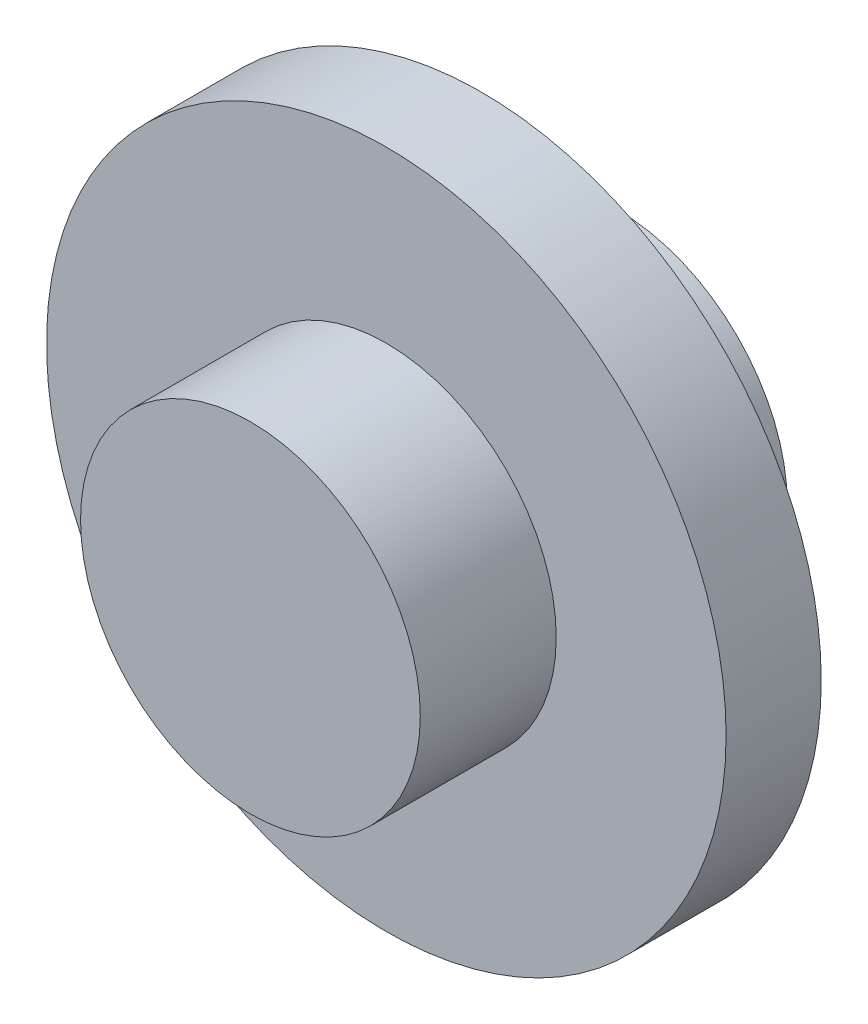
ISO-10303-21;
HEADER;
FILE_DESCRIPTION(('STEP AP214'),'2;1');
FILE_NAME('part.step','',(''),(''),'','','');
FILE_SCHEMA(('AUTOMOTIVE_DESIGN { 1 0 10303 214 1 1 1 1 }'));
ENDSEC;
DATA;
#1=APPLICATION_CONTEXT('core data for automotive mechanical design processes');
#2=APPLICATION_PROTOCOL_DEFINITION('international standard','automotive_design',2000,#1);
#3=PRODUCT_CONTEXT('',#1,'mechanical');
#4=PRODUCT('Part','Part','',(#3));
#5=PRODUCT_RELATED_PRODUCT_CATEGORY('part','',(#4));
#6=PRODUCT_DEFINITION_FORMATION('','',#4);
#7=PRODUCT_DEFINITION_CONTEXT('part definition',#1,'design');
#8=PRODUCT_DEFINITION('design','',#6,#7);
#9=PRODUCT_DEFINITION_SHAPE('','',#8);
#10=(LENGTH_UNIT() NAMED_UNIT(*) SI_UNIT(.MILLI.,.METRE.));
#11=(NAMED_UNIT(*) PLANE_ANGLE_UNIT() SI_UNIT($,.RADIAN.));
#12=(NAMED_UNIT(*) SI_UNIT($,.STERADIAN.) SOLID_ANGLE_UNIT());
#13=UNCERTAINTY_MEASURE_WITH_UNIT(LENGTH_MEASURE(1.E-05),#10,'distance_accuracy_value','');
#14=(GEOMETRIC_REPRESENTATION_CONTEXT(3) GLOBAL_UNCERTAINTY_ASSIGNED_CONTEXT((#13)) GLOBAL_UNIT_ASSIGNED_CONTEXT((#10,
#11,#12)) REPRESENTATION_CONTEXT('',''));
#15=CARTESIAN_POINT('',(0.,0.,0.));
#16=DIRECTION('',(0.,0.,1.));
#17=DIRECTION('',(1.,0.,0.));
#18=AXIS2_PLACEMENT_3D('',#15,#16,#17);
#19=CARTESIAN_POINT('',(0.,0.,10.));
#20=DIRECTION('',(0.,0.,-1.));
#21=DIRECTION('',(-1.,0.,0.));
#22=AXIS2_PLACEMENT_3D('',#19,#20,#21);
#23=CYLINDRICAL_SURFACE('',#22,12.5);
#24=CARTESIAN_POINT('',(0.,0.,10.));
#25=DIRECTION('',(0.,0.,1.));
#26=DIRECTION('',(1.,0.,0.));
#27=AXIS2_PLACEMENT_3D('',#24,#25,#26);
#28=CIRCLE('',#27,12.5);
#29=CARTESIAN_POINT('',(12.5,0.,10.));
#30=VERTEX_POINT('',#29);
#31=EDGE_CURVE('E45',#30,#30,#28,.T.);
#32=ORIENTED_EDGE('',*,*,#31,.F.);
#33=EDGE_LOOP('',(#32));
#34=FACE_BOUND('',#33,.T.);
#35=CARTESIAN_POINT('',(0.,0.,0.));
#36=DIRECTION('',(0.,0.,1.));
#37=DIRECTION('',(1.,0.,0.));
#38=AXIS2_PLACEMENT_3D('',#35,#36,#37);
#39=CIRCLE('',#38,12.5);
#40=CARTESIAN_POINT('',(12.5,0.,0.));
#41=VERTEX_POINT('',#40);
#42=EDGE_CURVE('E40',#41,#41,#39,.T.);
#43=ORIENTED_EDGE('',*,*,#42,.T.);
#44=EDGE_LOOP('',(#43));
#45=FACE_BOUND('',#44,.T.);
#46=ADVANCED_FACE('F37',(#34,#45),#23,.T.);
#47=CARTESIAN_POINT('',(0.,0.,0.));
#48=DIRECTION('',(0.,0.,1.));
#49=DIRECTION('',(1.,0.,0.));
#50=AXIS2_PLACEMENT_3D('',#47,#48,#49);
#51=PLANE('',#50);
#52=ORIENTED_EDGE('',*,*,#42,.F.);
#53=EDGE_LOOP('',(#52));
#54=FACE_BOUND('',#53,.T.);
#55=ADVANCED_FACE('F83',(#54),#51,.F.);
#56=CARTESIAN_POINT('',(0.,0.,17.));
#57=DIRECTION('',(0.,0.,-1.));
#58=DIRECTION('',(-1.,0.,0.));
#59=AXIS2_PLACEMENT_3D('',#56,#57,#58);
#60=CYLINDRICAL_SURFACE('',#59,25.);
#61=CARTESIAN_POINT('',(0.,0.,17.));
#62=DIRECTION('',(0.,0.,1.));
#63=DIRECTION('',(1.,0.,0.));
#64=AXIS2_PLACEMENT_3D('',#61,#62,#63);
#65=CIRCLE('',#64,25.);
#66=CARTESIAN_POINT('',(25.,0.,17.));
#67=VERTEX_POINT('',#66);
#68=EDGE_CURVE('E54',#67,#67,#65,.T.);
#69=ORIENTED_EDGE('',*,*,#68,.F.);
#70=EDGE_LOOP('',(#69));
#71=FACE_BOUND('',#70,.T.);
#72=CARTESIAN_POINT('',(0.,0.,10.));
#73=DIRECTION('',(0.,0.,1.));
#74=DIRECTION('',(1.,0.,0.));
#75=AXIS2_PLACEMENT_3D('',#72,#73,#74);
#76=CIRCLE('',#75,25.);
#77=CARTESIAN_POINT('',(25.,0.,10.));
#78=VERTEX_POINT('',#77);
#79=EDGE_CURVE('E58',#78,#78,#76,.T.);
#80=ORIENTED_EDGE('',*,*,#79,.T.);
#81=EDGE_LOOP('',(#80));
#82=FACE_BOUND('',#81,.T.);
#83=ADVANCED_FACE('F88',(#71,#82),#60,.T.);
#84=CARTESIAN_POINT('',(0.,0.,17.));
#85=DIRECTION('',(0.,0.,1.));
#86=DIRECTION('',(1.,0.,0.));
#87=AXIS2_PLACEMENT_3D('',#84,#85,#86);
#88=PLANE('',#87);
#89=CARTESIAN_POINT('',(0.,0.,17.));
#90=DIRECTION('',(0.,0.,1.));
#91=DIRECTION('',(1.,0.,0.));
#92=AXIS2_PLACEMENT_3D('',#89,#90,#91);
#93=CIRCLE('',#92,12.5);
#94=CARTESIAN_POINT('',(12.5,0.,17.));
#95=VERTEX_POINT('',#94);
#96=EDGE_CURVE('E10',#95,#95,#93,.T.);
#97=ORIENTED_EDGE('',*,*,#96,.F.);
#98=EDGE_LOOP('',(#97));
#99=FACE_BOUND('',#98,.T.);
#100=ORIENTED_EDGE('',*,*,#68,.T.);
#101=EDGE_LOOP('',(#100));
#102=FACE_BOUND('',#101,.T.);
#103=ADVANCED_FACE('F78',(#99,#102),#88,.T.);
#104=CARTESIAN_POINT('',(0.,0.,10.));
#105=DIRECTION('',(0.,0.,1.));
#106=DIRECTION('',(1.,0.,0.));
#107=AXIS2_PLACEMENT_3D('',#104,#105,#106);
#108=PLANE('',#107);
#109=ORIENTED_EDGE('',*,*,#31,.T.);
#110=EDGE_LOOP('',(#109));
#111=FACE_BOUND('',#110,.T.);
#112=ORIENTED_EDGE('',*,*,#79,.F.);
#113=EDGE_LOOP('',(#112));
#114=FACE_BOUND('',#113,.T.);
#115=ADVANCED_FACE('F71',(#111,#114),#108,.F.);
#116=CARTESIAN_POINT('',(0.,0.,27.));
#117=DIRECTION('',(0.,0.,-1.));
#118=DIRECTION('',(-1.,0.,0.));
#119=AXIS2_PLACEMENT_3D('',#116,#117,#118);
#120=CYLINDRICAL_SURFACE('',#119,12.5);
#121=CARTESIAN_POINT('',(0.,0.,27.));
#122=DIRECTION('',(0.,0.,1.));
#123=DIRECTION('',(1.,0.,0.));
#124=AXIS2_PLACEMENT_3D('',#121,#122,#123);
#125=CIRCLE('',#124,12.5);
#126=CARTESIAN_POINT('',(12.5,0.,27.));
#127=VERTEX_POINT('',#126);
#128=EDGE_CURVE('E53',#127,#127,#125,.T.);
#129=ORIENTED_EDGE('',*,*,#128,.F.);
#130=EDGE_LOOP('',(#129));
#131=FACE_BOUND('',#130,.T.);
#132=ORIENTED_EDGE('',*,*,#96,.T.);
#133=EDGE_LOOP('',(#132));
#134=FACE_BOUND('',#133,.T.);
#135=ADVANCED_FACE('F69',(#131,#134),#120,.T.);
#136=CARTESIAN_POINT('',(0.,0.,27.));
#137=DIRECTION('',(0.,0.,1.));
#138=DIRECTION('',(1.,0.,0.));
#139=AXIS2_PLACEMENT_3D('',#136,#137,#138);
#140=PLANE('',#139);
#141=ORIENTED_EDGE('',*,*,#128,.T.);
#142=EDGE_LOOP('',(#141));
#143=FACE_BOUND('',#142,.T.);
#144=ADVANCED_FACE('F67',(#143),#140,.T.);
#145=CLOSED_SHELL('',(#46,#55,#83,#103,#115,#135,#144));
#146=MANIFOLD_SOLID_BREP('B2',#145);
#147=ADVANCED_BREP_SHAPE_REPRESENTATION('',(#18,#146),#14);
#148=SHAPE_DEFINITION_REPRESENTATION(#9,#147);
ENDSEC;
END-ISO-10303-21;
